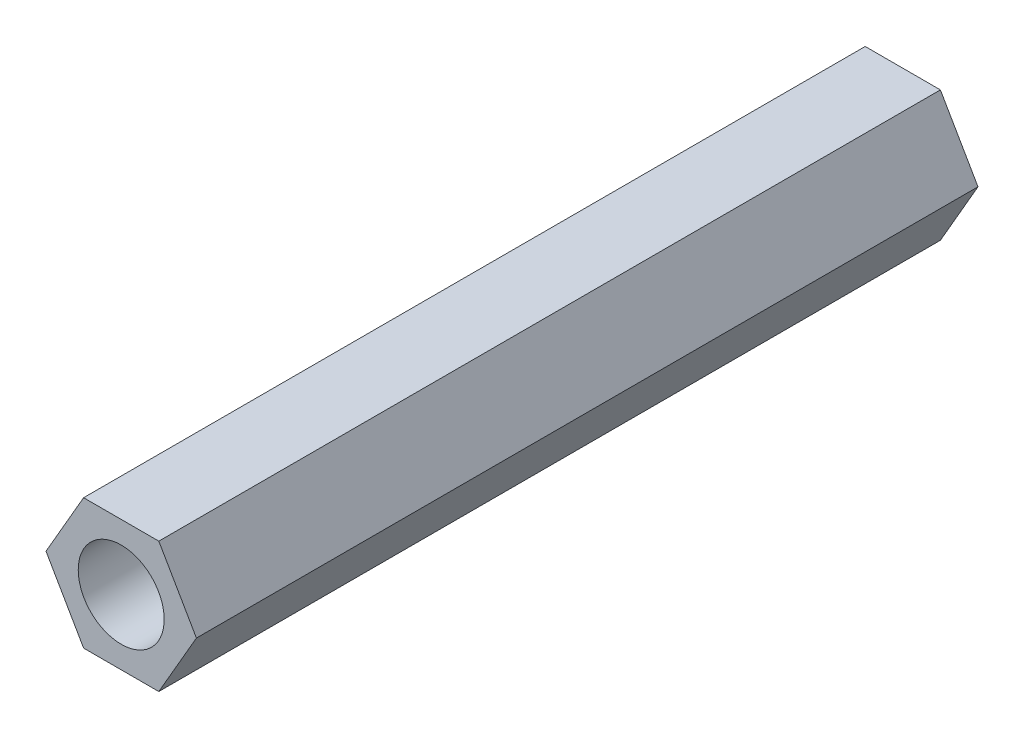
ISO-10303-21;
HEADER;
FILE_DESCRIPTION(('STEP AP214'),'2;1');
FILE_NAME('part.step','',(''),(''),'','','');
FILE_SCHEMA(('AUTOMOTIVE_DESIGN { 1 0 10303 214 1 1 1 1 }'));
ENDSEC;
DATA;
#1=APPLICATION_CONTEXT('core data for automotive mechanical design processes');
#2=APPLICATION_PROTOCOL_DEFINITION('international standard','automotive_design',2000,#1);
#3=PRODUCT_CONTEXT('',#1,'mechanical');
#4=PRODUCT('Part','Part','',(#3));
#5=PRODUCT_RELATED_PRODUCT_CATEGORY('part','',(#4));
#6=PRODUCT_DEFINITION_FORMATION('','',#4);
#7=PRODUCT_DEFINITION_CONTEXT('part definition',#1,'design');
#8=PRODUCT_DEFINITION('design','',#6,#7);
#9=PRODUCT_DEFINITION_SHAPE('','',#8);
#10=(LENGTH_UNIT() NAMED_UNIT(*) SI_UNIT(.MILLI.,.METRE.));
#11=(NAMED_UNIT(*) PLANE_ANGLE_UNIT() SI_UNIT($,.RADIAN.));
#12=(NAMED_UNIT(*) SI_UNIT($,.STERADIAN.) SOLID_ANGLE_UNIT());
#13=UNCERTAINTY_MEASURE_WITH_UNIT(LENGTH_MEASURE(1.E-05),#10,'distance_accuracy_value','');
#14=(GEOMETRIC_REPRESENTATION_CONTEXT(3) GLOBAL_UNCERTAINTY_ASSIGNED_CONTEXT((#13)) GLOBAL_UNIT_ASSIGNED_CONTEXT((#10,
#11,#12)) REPRESENTATION_CONTEXT('',''));
#15=CARTESIAN_POINT('',(0.,0.,0.));
#16=DIRECTION('',(0.,0.,1.));
#17=DIRECTION('',(1.,0.,0.));
#18=AXIS2_PLACEMENT_3D('',#15,#16,#17);
#19=CARTESIAN_POINT('',(1.83308710467706,3.175,19.05));
#20=DIRECTION('',(0.,-1.,0.));
#21=DIRECTION('',(0.,0.,-1.));
#22=AXIS2_PLACEMENT_3D('',#19,#20,#21);
#23=PLANE('',#22);
#24=DIRECTION('',(0.,0.,1.));
#25=VECTOR('',#24,1.);
#26=CARTESIAN_POINT('',(-1.83308710467706,3.175,19.05));
#27=LINE('',#26,#25);
#28=CARTESIAN_POINT('',(-1.83308710467706,3.175,-19.05));
#29=VERTEX_POINT('',#28);
#30=CARTESIAN_POINT('',(-1.83308710467706,3.175,19.05));
#31=VERTEX_POINT('',#30);
#32=EDGE_CURVE('E66',#29,#31,#27,.T.);
#33=ORIENTED_EDGE('',*,*,#32,.T.);
#34=DIRECTION('',(1.,0.,0.));
#35=VECTOR('',#34,1.);
#36=CARTESIAN_POINT('',(-5.49926131403119,3.175,19.05));
#37=LINE('',#36,#35);
#38=CARTESIAN_POINT('',(1.83308710467706,3.175,19.05));
#39=VERTEX_POINT('',#38);
#40=EDGE_CURVE('E106',#39,#31,#37,.F.);
#41=ORIENTED_EDGE('',*,*,#40,.F.);
#42=DIRECTION('',(0.,0.,1.));
#43=VECTOR('',#42,1.);
#44=CARTESIAN_POINT('',(1.83308710467706,3.175,19.05));
#45=LINE('',#44,#43);
#46=CARTESIAN_POINT('',(1.83308710467706,3.175,-19.05));
#47=VERTEX_POINT('',#46);
#48=EDGE_CURVE('E93',#39,#47,#45,.F.);
#49=ORIENTED_EDGE('',*,*,#48,.T.);
#50=DIRECTION('',(1.,0.,0.));
#51=VECTOR('',#50,1.);
#52=CARTESIAN_POINT('',(-5.49926131403119,3.175,-19.05));
#53=LINE('',#52,#51);
#54=EDGE_CURVE('E107',#47,#29,#53,.F.);
#55=ORIENTED_EDGE('',*,*,#54,.T.);
#56=EDGE_LOOP('',(#33,#41,#49,#55));
#57=FACE_BOUND('',#56,.T.);
#58=ADVANCED_FACE('F17',(#57),#23,.F.);
#59=CARTESIAN_POINT('',(-1.83308710467706,3.175,19.05));
#60=DIRECTION('',(0.866025403784439,-0.5,0.));
#61=DIRECTION('',(0.5,0.866025403784439,0.));
#62=AXIS2_PLACEMENT_3D('',#59,#60,#61);
#63=PLANE('',#62);
#64=DIRECTION('',(0.,0.,1.));
#65=VECTOR('',#64,1.);
#66=CARTESIAN_POINT('',(-3.66617420935413,0.,19.05));
#67=LINE('',#66,#65);
#68=CARTESIAN_POINT('',(-3.66617420935413,0.,-19.05));
#69=VERTEX_POINT('',#68);
#70=CARTESIAN_POINT('',(-3.66617420935413,0.,19.05));
#71=VERTEX_POINT('',#70);
#72=EDGE_CURVE('E73',#69,#71,#67,.T.);
#73=ORIENTED_EDGE('',*,*,#72,.T.);
#74=DIRECTION('',(-0.5,-0.866025403784439,0.));
#75=VECTOR('',#74,1.);
#76=CARTESIAN_POINT('',(-1.83308710467706,3.175,19.05));
#77=LINE('',#76,#75);
#78=EDGE_CURVE('E108',#31,#71,#77,.T.);
#79=ORIENTED_EDGE('',*,*,#78,.F.);
#80=ORIENTED_EDGE('',*,*,#32,.F.);
#81=DIRECTION('',(-0.5,-0.866025403784439,0.));
#82=VECTOR('',#81,1.);
#83=CARTESIAN_POINT('',(-1.83308710467706,3.175,-19.05));
#84=LINE('',#83,#82);
#85=EDGE_CURVE('E86',#29,#69,#84,.T.);
#86=ORIENTED_EDGE('',*,*,#85,.T.);
#87=EDGE_LOOP('',(#73,#79,#80,#86));
#88=FACE_BOUND('',#87,.T.);
#89=ADVANCED_FACE('F92',(#88),#63,.F.);
#90=CARTESIAN_POINT('',(-3.66617420935413,0.,19.05));
#91=DIRECTION('',(0.866025403784439,0.5,0.));
#92=DIRECTION('',(-0.5,0.866025403784439,0.));
#93=AXIS2_PLACEMENT_3D('',#90,#91,#92);
#94=PLANE('',#93);
#95=DIRECTION('',(0.,0.,1.));
#96=VECTOR('',#95,1.);
#97=CARTESIAN_POINT('',(-1.83308710467706,-3.175,19.05));
#98=LINE('',#97,#96);
#99=CARTESIAN_POINT('',(-1.83308710467706,-3.175,-19.05));
#100=VERTEX_POINT('',#99);
#101=CARTESIAN_POINT('',(-1.83308710467706,-3.175,19.05));
#102=VERTEX_POINT('',#101);
#103=EDGE_CURVE('E79',#100,#102,#98,.T.);
#104=ORIENTED_EDGE('',*,*,#103,.T.);
#105=DIRECTION('',(0.5,-0.866025403784439,0.));
#106=VECTOR('',#105,1.);
#107=CARTESIAN_POINT('',(-3.66617420935413,0.,19.05));
#108=LINE('',#107,#106);
#109=EDGE_CURVE('E78',#71,#102,#108,.T.);
#110=ORIENTED_EDGE('',*,*,#109,.F.);
#111=ORIENTED_EDGE('',*,*,#72,.F.);
#112=DIRECTION('',(0.5,-0.866025403784439,0.));
#113=VECTOR('',#112,1.);
#114=CARTESIAN_POINT('',(-3.66617420935413,0.,-19.05));
#115=LINE('',#114,#113);
#116=EDGE_CURVE('E77',#69,#100,#115,.T.);
#117=ORIENTED_EDGE('',*,*,#116,.T.);
#118=EDGE_LOOP('',(#104,#110,#111,#117));
#119=FACE_BOUND('',#118,.T.);
#120=ADVANCED_FACE('F76',(#119),#94,.F.);
#121=CARTESIAN_POINT('',(-1.83308710467706,-3.175,19.05));
#122=DIRECTION('',(0.,1.,0.));
#123=DIRECTION('',(0.,0.,1.));
#124=AXIS2_PLACEMENT_3D('',#121,#122,#123);
#125=PLANE('',#124);
#126=DIRECTION('',(0.,0.,1.));
#127=VECTOR('',#126,1.);
#128=CARTESIAN_POINT('',(1.83308710467706,-3.175,19.05));
#129=LINE('',#128,#127);
#130=CARTESIAN_POINT('',(1.83308710467706,-3.175,-19.05));
#131=VERTEX_POINT('',#130);
#132=CARTESIAN_POINT('',(1.83308710467706,-3.175,19.05));
#133=VERTEX_POINT('',#132);
#134=EDGE_CURVE('E100',#131,#133,#129,.T.);
#135=ORIENTED_EDGE('',*,*,#134,.T.);
#136=DIRECTION('',(1.,0.,0.));
#137=VECTOR('',#136,1.);
#138=CARTESIAN_POINT('',(-5.49926131403119,-3.175,19.05));
#139=LINE('',#138,#137);
#140=EDGE_CURVE('E110',#102,#133,#139,.T.);
#141=ORIENTED_EDGE('',*,*,#140,.F.);
#142=ORIENTED_EDGE('',*,*,#103,.F.);
#143=DIRECTION('',(1.,0.,0.));
#144=VECTOR('',#143,1.);
#145=CARTESIAN_POINT('',(-5.49926131403119,-3.175,-19.05));
#146=LINE('',#145,#144);
#147=EDGE_CURVE('E90',#100,#131,#146,.T.);
#148=ORIENTED_EDGE('',*,*,#147,.T.);
#149=EDGE_LOOP('',(#135,#141,#142,#148));
#150=FACE_BOUND('',#149,.T.);
#151=ADVANCED_FACE('F122',(#150),#125,.F.);
#152=CARTESIAN_POINT('',(1.83308710467706,-3.175,19.05));
#153=DIRECTION('',(-0.866025403784439,0.5,0.));
#154=DIRECTION('',(-0.5,-0.866025403784439,0.));
#155=AXIS2_PLACEMENT_3D('',#152,#153,#154);
#156=PLANE('',#155);
#157=DIRECTION('',(0.,0.,1.));
#158=VECTOR('',#157,1.);
#159=CARTESIAN_POINT('',(3.66617420935412,0.,19.05));
#160=LINE('',#159,#158);
#161=CARTESIAN_POINT('',(3.66617420935412,0.,-19.05));
#162=VERTEX_POINT('',#161);
#163=CARTESIAN_POINT('',(3.66617420935412,0.,19.05));
#164=VERTEX_POINT('',#163);
#165=EDGE_CURVE('E95',#162,#164,#160,.T.);
#166=ORIENTED_EDGE('',*,*,#165,.T.);
#167=DIRECTION('',(0.5,0.866025403784439,0.));
#168=VECTOR('',#167,1.);
#169=CARTESIAN_POINT('',(1.83308710467706,-3.175,19.05));
#170=LINE('',#169,#168);
#171=EDGE_CURVE('E33',#133,#164,#170,.T.);
#172=ORIENTED_EDGE('',*,*,#171,.F.);
#173=ORIENTED_EDGE('',*,*,#134,.F.);
#174=DIRECTION('',(0.5,0.866025403784439,0.));
#175=VECTOR('',#174,1.);
#176=CARTESIAN_POINT('',(1.83308710467706,-3.175,-19.05));
#177=LINE('',#176,#175);
#178=EDGE_CURVE('E119',#131,#162,#177,.T.);
#179=ORIENTED_EDGE('',*,*,#178,.T.);
#180=EDGE_LOOP('',(#166,#172,#173,#179));
#181=FACE_BOUND('',#180,.T.);
#182=ADVANCED_FACE('F150',(#181),#156,.F.);
#183=CARTESIAN_POINT('',(3.66617420935412,0.,19.05));
#184=DIRECTION('',(-0.866025403784439,-0.5,0.));
#185=DIRECTION('',(0.5,-0.866025403784439,0.));
#186=AXIS2_PLACEMENT_3D('',#183,#184,#185);
#187=PLANE('',#186);
#188=ORIENTED_EDGE('',*,*,#48,.F.);
#189=DIRECTION('',(-0.5,0.866025403784439,0.));
#190=VECTOR('',#189,1.);
#191=CARTESIAN_POINT('',(3.66617420935412,0.,19.05));
#192=LINE('',#191,#190);
#193=EDGE_CURVE('E124',#164,#39,#192,.T.);
#194=ORIENTED_EDGE('',*,*,#193,.F.);
#195=ORIENTED_EDGE('',*,*,#165,.F.);
#196=DIRECTION('',(-0.5,0.866025403784439,0.));
#197=VECTOR('',#196,1.);
#198=CARTESIAN_POINT('',(3.66617420935412,0.,-19.05));
#199=LINE('',#198,#197);
#200=EDGE_CURVE('E116',#162,#47,#199,.T.);
#201=ORIENTED_EDGE('',*,*,#200,.T.);
#202=EDGE_LOOP('',(#188,#194,#195,#201));
#203=FACE_BOUND('',#202,.T.);
#204=ADVANCED_FACE('F145',(#203),#187,.F.);
#205=CARTESIAN_POINT('',(-5.49926131403119,3.175,-19.05));
#206=DIRECTION('',(0.,0.,1.));
#207=DIRECTION('',(1.,0.,0.));
#208=AXIS2_PLACEMENT_3D('',#205,#206,#207);
#209=PLANE('',#208);
#210=CARTESIAN_POINT('',(0.,0.,-19.05));
#211=DIRECTION('',(0.,0.,-1.));
#212=DIRECTION('',(-1.,0.,0.));
#213=AXIS2_PLACEMENT_3D('',#210,#211,#212);
#214=CIRCLE('',#213,2.0955);
#215=CARTESIAN_POINT('',(-2.0955,0.,-19.05));
#216=VERTEX_POINT('',#215);
#217=EDGE_CURVE('E20',#216,#216,#214,.F.);
#218=ORIENTED_EDGE('',*,*,#217,.T.);
#219=EDGE_LOOP('',(#218));
#220=FACE_BOUND('',#219,.T.);
#221=ORIENTED_EDGE('',*,*,#200,.F.);
#222=ORIENTED_EDGE('',*,*,#178,.F.);
#223=ORIENTED_EDGE('',*,*,#147,.F.);
#224=ORIENTED_EDGE('',*,*,#116,.F.);
#225=ORIENTED_EDGE('',*,*,#85,.F.);
#226=ORIENTED_EDGE('',*,*,#54,.F.);
#227=EDGE_LOOP('',(#221,#222,#223,#224,#225,#226));
#228=FACE_BOUND('',#227,.T.);
#229=ADVANCED_FACE('F84',(#220,#228),#209,.F.);
#230=CARTESIAN_POINT('',(-5.49926131403119,3.175,19.05));
#231=DIRECTION('',(0.,0.,1.));
#232=DIRECTION('',(1.,0.,0.));
#233=AXIS2_PLACEMENT_3D('',#230,#231,#232);
#234=PLANE('',#233);
#235=CARTESIAN_POINT('',(0.,0.,19.05));
#236=DIRECTION('',(0.,0.,-1.));
#237=DIRECTION('',(-1.,0.,0.));
#238=AXIS2_PLACEMENT_3D('',#235,#236,#237);
#239=CIRCLE('',#238,2.0955);
#240=CARTESIAN_POINT('',(-2.0955,0.,19.05));
#241=VERTEX_POINT('',#240);
#242=EDGE_CURVE('E11',#241,#241,#239,.T.);
#243=ORIENTED_EDGE('',*,*,#242,.T.);
#244=EDGE_LOOP('',(#243));
#245=FACE_BOUND('',#244,.T.);
#246=ORIENTED_EDGE('',*,*,#171,.T.);
#247=ORIENTED_EDGE('',*,*,#193,.T.);
#248=ORIENTED_EDGE('',*,*,#40,.T.);
#249=ORIENTED_EDGE('',*,*,#78,.T.);
#250=ORIENTED_EDGE('',*,*,#109,.T.);
#251=ORIENTED_EDGE('',*,*,#140,.T.);
#252=EDGE_LOOP('',(#246,#247,#248,#249,#250,#251));
#253=FACE_BOUND('',#252,.T.);
#254=ADVANCED_FACE('F135',(#245,#253),#234,.T.);
#255=CARTESIAN_POINT('',(0.,0.,19.05));
#256=DIRECTION('',(0.,0.,-1.));
#257=DIRECTION('',(-1.,0.,0.));
#258=AXIS2_PLACEMENT_3D('',#255,#256,#257);
#259=CYLINDRICAL_SURFACE('',#258,2.0955);
#260=ORIENTED_EDGE('',*,*,#217,.F.);
#261=EDGE_LOOP('',(#260));
#262=FACE_BOUND('',#261,.T.);
#263=ORIENTED_EDGE('',*,*,#242,.F.);
#264=EDGE_LOOP('',(#263));
#265=FACE_BOUND('',#264,.T.);
#266=ADVANCED_FACE('F132',(#262,#265),#259,.F.);
#267=CLOSED_SHELL('',(#58,#89,#120,#151,#182,#204,#229,#254,#266));
#268=MANIFOLD_SOLID_BREP('B1',#267);
#269=ADVANCED_BREP_SHAPE_REPRESENTATION('',(#18,#268),#14);
#270=SHAPE_DEFINITION_REPRESENTATION(#9,#269);
ENDSEC;
END-ISO-10303-21;
